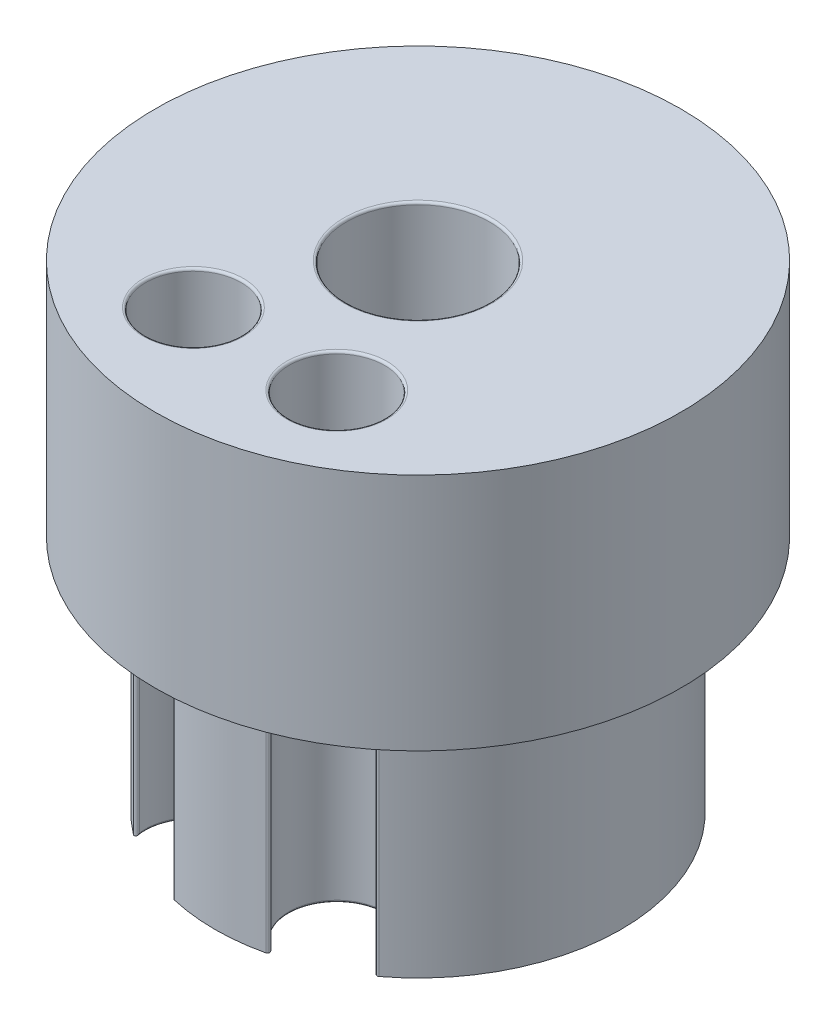
ISO-10303-21;
HEADER;
FILE_DESCRIPTION(('STEP AP214'),'2;1');
FILE_NAME('part.step','',(''),(''),'','','');
FILE_SCHEMA(('AUTOMOTIVE_DESIGN { 1 0 10303 214 1 1 1 1 }'));
ENDSEC;
DATA;
#1=APPLICATION_CONTEXT('core data for automotive mechanical design processes');
#2=APPLICATION_PROTOCOL_DEFINITION('international standard','automotive_design',2000,#1);
#3=PRODUCT_CONTEXT('',#1,'mechanical');
#4=PRODUCT('Part','Part','',(#3));
#5=PRODUCT_RELATED_PRODUCT_CATEGORY('part','',(#4));
#6=PRODUCT_DEFINITION_FORMATION('','',#4);
#7=PRODUCT_DEFINITION_CONTEXT('part definition',#1,'design');
#8=PRODUCT_DEFINITION('design','',#6,#7);
#9=PRODUCT_DEFINITION_SHAPE('','',#8);
#10=(LENGTH_UNIT() NAMED_UNIT(*) SI_UNIT(.MILLI.,.METRE.));
#11=(NAMED_UNIT(*) PLANE_ANGLE_UNIT() SI_UNIT($,.RADIAN.));
#12=(NAMED_UNIT(*) SI_UNIT($,.STERADIAN.) SOLID_ANGLE_UNIT());
#13=UNCERTAINTY_MEASURE_WITH_UNIT(LENGTH_MEASURE(1.E-05),#10,'distance_accuracy_value','');
#14=(GEOMETRIC_REPRESENTATION_CONTEXT(3) GLOBAL_UNCERTAINTY_ASSIGNED_CONTEXT((#13)) GLOBAL_UNIT_ASSIGNED_CONTEXT((#10,
#11,#12)) REPRESENTATION_CONTEXT('',''));
#15=CARTESIAN_POINT('',(0.,0.,0.));
#16=DIRECTION('',(0.,0.,1.));
#17=DIRECTION('',(1.,0.,0.));
#18=AXIS2_PLACEMENT_3D('',#15,#16,#17);
#19=CARTESIAN_POINT('',(0.,-1.,0.));
#20=DIRECTION('',(0.,1.,0.));
#21=DIRECTION('',(0.,0.,1.));
#22=AXIS2_PLACEMENT_3D('',#19,#20,#21);
#23=CYLINDRICAL_SURFACE('',#22,0.425);
#24=CARTESIAN_POINT('',(0.,-0.5,0.));
#25=DIRECTION('',(0.,-1.,0.));
#26=DIRECTION('',(0.,0.,-1.));
#27=AXIS2_PLACEMENT_3D('',#24,#25,#26);
#28=CIRCLE('',#27,0.425);
#29=CARTESIAN_POINT('',(-0.257018482132162,-0.5,0.338476734566025));
#30=VERTEX_POINT('',#29);
#31=CARTESIAN_POINT('',(0.257018482132162,-0.5,0.338476734566025));
#32=VERTEX_POINT('',#31);
#33=EDGE_CURVE('E314',#30,#32,#28,.T.);
#34=ORIENTED_EDGE('',*,*,#33,.T.);
#35=DIRECTION('',(0.,1.,0.));
#36=VECTOR('',#35,1.);
#37=CARTESIAN_POINT('',(0.257018482132162,-1.,0.338476734566025));
#38=LINE('',#37,#36);
#39=CARTESIAN_POINT('',(0.257018482132162,-1.,0.338476734566025));
#40=VERTEX_POINT('',#39);
#41=EDGE_CURVE('E287',#32,#40,#38,.F.);
#42=ORIENTED_EDGE('',*,*,#41,.T.);
#43=CARTESIAN_POINT('',(0.,-1.,0.));
#44=DIRECTION('',(0.,-1.,0.));
#45=DIRECTION('',(0.,0.,-1.));
#46=AXIS2_PLACEMENT_3D('',#43,#44,#45);
#47=CIRCLE('',#46,0.425);
#48=CARTESIAN_POINT('',(-0.257018482132162,-1.,0.338476734566025));
#49=VERTEX_POINT('',#48);
#50=EDGE_CURVE('E147',#49,#40,#47,.T.);
#51=ORIENTED_EDGE('',*,*,#50,.F.);
#52=DIRECTION('',(0.,1.,0.));
#53=VECTOR('',#52,1.);
#54=CARTESIAN_POINT('',(-0.257018482132162,-1.,0.338476734566025));
#55=LINE('',#54,#53);
#56=EDGE_CURVE('E285',#49,#30,#55,.T.);
#57=ORIENTED_EDGE('',*,*,#56,.T.);
#58=EDGE_LOOP('',(#34,#42,#51,#57));
#59=FACE_BOUND('',#58,.T.);
#60=ADVANCED_FACE('F32',(#59),#23,.T.);
#61=CARTESIAN_POINT('',(0.,-0.5,0.));
#62=DIRECTION('',(0.,1.,0.));
#63=DIRECTION('',(0.,0.,1.));
#64=AXIS2_PLACEMENT_3D('',#61,#62,#63);
#65=CYLINDRICAL_SURFACE('',#64,0.55);
#66=CARTESIAN_POINT('',(0.,-0.5,0.));
#67=DIRECTION('',(0.,1.,0.));
#68=DIRECTION('',(0.,0.,1.));
#69=AXIS2_PLACEMENT_3D('',#66,#67,#68);
#70=CIRCLE('',#69,0.55);
#71=CARTESIAN_POINT('',(0.,-0.5,0.55));
#72=VERTEX_POINT('',#71);
#73=EDGE_CURVE('E320',#72,#72,#70,.T.);
#74=ORIENTED_EDGE('',*,*,#73,.T.);
#75=EDGE_LOOP('',(#74));
#76=FACE_BOUND('',#75,.T.);
#77=CARTESIAN_POINT('',(0.,0.,0.));
#78=DIRECTION('',(0.,1.,0.));
#79=DIRECTION('',(0.,0.,1.));
#80=AXIS2_PLACEMENT_3D('',#77,#78,#79);
#81=CIRCLE('',#80,0.55);
#82=CARTESIAN_POINT('',(0.,0.,0.55));
#83=VERTEX_POINT('',#82);
#84=EDGE_CURVE('E146',#83,#83,#81,.T.);
#85=ORIENTED_EDGE('',*,*,#84,.F.);
#86=EDGE_LOOP('',(#85));
#87=FACE_BOUND('',#86,.T.);
#88=ADVANCED_FACE('F344',(#76,#87),#65,.T.);
#89=CARTESIAN_POINT('',(0.,-0.5,0.));
#90=DIRECTION('',(0.,1.,0.));
#91=DIRECTION('',(0.,0.,1.));
#92=AXIS2_PLACEMENT_3D('',#89,#90,#91);
#93=PLANE('',#92);
#94=CARTESIAN_POINT('',(0.0946141518261391,-0.5,0.409204303831497));
#95=DIRECTION('',(0.,1.,0.));
#96=DIRECTION('',(0.,0.,1.));
#97=AXIS2_PLACEMENT_3D('',#94,#95,#96);
#98=CIRCLE('',#97,0.005);
#99=CARTESIAN_POINT('',(0.0957405107764503,-0.5,0.414075783639015));
#100=VERTEX_POINT('',#99);
#101=CARTESIAN_POINT('',(0.098923567361903,-0.5,0.411739838832265));
#102=VERTEX_POINT('',#101);
#103=EDGE_CURVE('E153',#100,#102,#98,.T.);
#104=ORIENTED_EDGE('',*,*,#103,.T.);
#105=CARTESIAN_POINT('',(0.15,-0.5,0.32));
#106=DIRECTION('',(0.,1.,0.));
#107=DIRECTION('',(0.,0.,1.));
#108=AXIS2_PLACEMENT_3D('',#105,#106,#107);
#109=CIRCLE('',#108,0.105);
#110=CARTESIAN_POINT('',(0.253186801406577,-0.5,0.339428947873824));
#111=VERTEX_POINT('',#110);
#112=EDGE_CURVE('E155',#102,#111,#109,.T.);
#113=ORIENTED_EDGE('',*,*,#112,.T.);
#114=CARTESIAN_POINT('',(0.253994735283549,-0.5,0.334494655335836));
#115=DIRECTION('',(0.,1.,0.));
#116=DIRECTION('',(0.,0.,1.));
#117=AXIS2_PLACEMENT_3D('',#114,#115,#116);
#118=CIRCLE('',#117,0.005);
#119=EDGE_CURVE('E174',#111,#32,#118,.T.);
#120=ORIENTED_EDGE('',*,*,#119,.T.);
#121=ORIENTED_EDGE('',*,*,#33,.F.);
#122=CARTESIAN_POINT('',(-0.253994735283549,-0.5,0.334494655335837));
#123=DIRECTION('',(0.,1.,0.));
#124=DIRECTION('',(0.,0.,1.));
#125=AXIS2_PLACEMENT_3D('',#122,#123,#124);
#126=CIRCLE('',#125,0.005);
#127=CARTESIAN_POINT('',(-0.253186801406577,-0.5,0.339428947873824));
#128=VERTEX_POINT('',#127);
#129=EDGE_CURVE('E11',#30,#128,#126,.T.);
#130=ORIENTED_EDGE('',*,*,#129,.T.);
#131=CARTESIAN_POINT('',(-0.15,-0.5,0.32));
#132=DIRECTION('',(0.,1.,0.));
#133=DIRECTION('',(0.,0.,1.));
#134=AXIS2_PLACEMENT_3D('',#131,#132,#133);
#135=CIRCLE('',#134,0.105);
#136=CARTESIAN_POINT('',(-0.0989235673619029,-0.5,0.411739838832265));
#137=VERTEX_POINT('',#136);
#138=EDGE_CURVE('E54',#128,#137,#135,.T.);
#139=ORIENTED_EDGE('',*,*,#138,.T.);
#140=CARTESIAN_POINT('',(-0.0946141518261391,-0.5,0.409204303831497));
#141=DIRECTION('',(0.,1.,0.));
#142=DIRECTION('',(0.,0.,1.));
#143=AXIS2_PLACEMENT_3D('',#140,#141,#142);
#144=CIRCLE('',#143,0.005);
#145=CARTESIAN_POINT('',(-0.0957405107764502,-0.5,0.414075783639015));
#146=VERTEX_POINT('',#145);
#147=EDGE_CURVE('E46',#137,#146,#144,.T.);
#148=ORIENTED_EDGE('',*,*,#147,.T.);
#149=EDGE_CURVE('E312',#100,#146,#28,.T.);
#150=ORIENTED_EDGE('',*,*,#149,.F.);
#151=EDGE_LOOP('',(#104,#113,#120,#121,#130,#139,#148,#150));
#152=FACE_BOUND('',#151,.T.);
#153=ORIENTED_EDGE('',*,*,#73,.F.);
#154=EDGE_LOOP('',(#153));
#155=FACE_BOUND('',#154,.T.);
#156=ADVANCED_FACE('F310',(#152,#155),#93,.F.);
#157=CARTESIAN_POINT('',(0.,0.,0.));
#158=DIRECTION('',(0.,1.,0.));
#159=DIRECTION('',(0.,0.,1.));
#160=AXIS2_PLACEMENT_3D('',#157,#158,#159);
#161=PLANE('',#160);
#162=CARTESIAN_POINT('',(0.,0.,0.));
#163=DIRECTION('',(0.,1.,0.));
#164=DIRECTION('',(0.,0.,1.));
#165=AXIS2_PLACEMENT_3D('',#162,#163,#164);
#166=CIRCLE('',#165,0.155);
#167=CARTESIAN_POINT('',(0.,0.,0.155));
#168=VERTEX_POINT('',#167);
#169=EDGE_CURVE('E334',#168,#168,#166,.F.);
#170=ORIENTED_EDGE('',*,*,#169,.T.);
#171=EDGE_LOOP('',(#170));
#172=FACE_BOUND('',#171,.T.);
#173=CARTESIAN_POINT('',(0.15,0.,0.32));
#174=DIRECTION('',(0.,1.,0.));
#175=DIRECTION('',(0.,0.,1.));
#176=AXIS2_PLACEMENT_3D('',#173,#174,#175);
#177=CIRCLE('',#176,0.105);
#178=CARTESIAN_POINT('',(0.15,0.,0.425));
#179=VERTEX_POINT('',#178);
#180=EDGE_CURVE('E331',#179,#179,#177,.F.);
#181=ORIENTED_EDGE('',*,*,#180,.T.);
#182=EDGE_LOOP('',(#181));
#183=FACE_BOUND('',#182,.T.);
#184=CARTESIAN_POINT('',(-0.15,0.,0.32));
#185=DIRECTION('',(0.,1.,0.));
#186=DIRECTION('',(0.,0.,1.));
#187=AXIS2_PLACEMENT_3D('',#184,#185,#186);
#188=CIRCLE('',#187,0.105);
#189=CARTESIAN_POINT('',(-0.15,0.,0.425));
#190=VERTEX_POINT('',#189);
#191=EDGE_CURVE('E328',#190,#190,#188,.F.);
#192=ORIENTED_EDGE('',*,*,#191,.T.);
#193=EDGE_LOOP('',(#192));
#194=FACE_BOUND('',#193,.T.);
#195=ORIENTED_EDGE('',*,*,#84,.T.);
#196=EDGE_LOOP('',(#195));
#197=FACE_BOUND('',#196,.T.);
#198=ADVANCED_FACE('F354',(#172,#183,#194,#197),#161,.T.);
#199=CARTESIAN_POINT('',(0.0957405107764503,-1.,0.414075783639015));
#200=VERTEX_POINT('',#199);
#201=CARTESIAN_POINT('',(-0.0957405107764502,-1.,0.414075783639015));
#202=VERTEX_POINT('',#201);
#203=EDGE_CURVE('E129',#200,#202,#47,.T.);
#204=ORIENTED_EDGE('',*,*,#203,.F.);
#205=DIRECTION('',(0.,1.,0.));
#206=VECTOR('',#205,1.);
#207=CARTESIAN_POINT('',(0.0957405107764503,-1.,0.414075783639015));
#208=LINE('',#207,#206);
#209=EDGE_CURVE('E142',#200,#100,#208,.T.);
#210=ORIENTED_EDGE('',*,*,#209,.T.);
#211=ORIENTED_EDGE('',*,*,#149,.T.);
#212=DIRECTION('',(0.,1.,0.));
#213=VECTOR('',#212,1.);
#214=CARTESIAN_POINT('',(-0.0957405107764503,-1.,0.414075783639015));
#215=LINE('',#214,#213);
#216=EDGE_CURVE('E145',#146,#202,#215,.F.);
#217=ORIENTED_EDGE('',*,*,#216,.T.);
#218=EDGE_LOOP('',(#204,#210,#211,#217));
#219=FACE_BOUND('',#218,.T.);
#220=ADVANCED_FACE('F140',(#219),#23,.T.);
#221=CARTESIAN_POINT('',(0.,-1.,0.));
#222=DIRECTION('',(0.,-1.,0.));
#223=DIRECTION('',(0.,0.,-1.));
#224=AXIS2_PLACEMENT_3D('',#221,#222,#223);
#225=PLANE('',#224);
#226=CARTESIAN_POINT('',(0.,-1.,0.));
#227=DIRECTION('',(0.,-1.,0.));
#228=DIRECTION('',(0.,0.,-1.));
#229=AXIS2_PLACEMENT_3D('',#226,#227,#228);
#230=CIRCLE('',#229,0.155);
#231=CARTESIAN_POINT('',(0.,-1.,-0.155));
#232=VERTEX_POINT('',#231);
#233=EDGE_CURVE('E282',#232,#232,#230,.F.);
#234=ORIENTED_EDGE('',*,*,#233,.T.);
#235=EDGE_LOOP('',(#234));
#236=FACE_BOUND('',#235,.T.);
#237=ORIENTED_EDGE('',*,*,#50,.T.);
#238=CARTESIAN_POINT('',(0.253994735283549,-1.,0.334494655335836));
#239=DIRECTION('',(0.,-1.,0.));
#240=DIRECTION('',(0.,0.,-1.));
#241=AXIS2_PLACEMENT_3D('',#238,#239,#240);
#242=CIRCLE('',#241,0.005);
#243=CARTESIAN_POINT('',(0.253186801406558,-1.,0.339428947873821));
#244=VERTEX_POINT('',#243);
#245=EDGE_CURVE('E280',#40,#244,#242,.T.);
#246=ORIENTED_EDGE('',*,*,#245,.T.);
#247=CARTESIAN_POINT('',(0.15,-1.,0.32));
#248=DIRECTION('',(0.,-1.,0.));
#249=DIRECTION('',(0.,0.,-1.));
#250=AXIS2_PLACEMENT_3D('',#247,#248,#249);
#251=CIRCLE('',#250,0.105);
#252=CARTESIAN_POINT('',(0.0989235673619124,-1.,0.411739838832248));
#253=VERTEX_POINT('',#252);
#254=EDGE_CURVE('E131',#244,#253,#251,.F.);
#255=ORIENTED_EDGE('',*,*,#254,.T.);
#256=CARTESIAN_POINT('',(0.0946141518261391,-1.,0.409204303831497));
#257=DIRECTION('',(0.,-1.,0.));
#258=DIRECTION('',(0.,0.,-1.));
#259=AXIS2_PLACEMENT_3D('',#256,#257,#258);
#260=CIRCLE('',#259,0.005);
#261=EDGE_CURVE('E125',#253,#200,#260,.T.);
#262=ORIENTED_EDGE('',*,*,#261,.T.);
#263=ORIENTED_EDGE('',*,*,#203,.T.);
#264=CARTESIAN_POINT('',(-0.0946141518261391,-1.,0.409204303831497));
#265=DIRECTION('',(0.,-1.,0.));
#266=DIRECTION('',(0.,0.,-1.));
#267=AXIS2_PLACEMENT_3D('',#264,#265,#266);
#268=CIRCLE('',#267,0.005);
#269=CARTESIAN_POINT('',(-0.0989235673619123,-1.,0.411739838832248));
#270=VERTEX_POINT('',#269);
#271=EDGE_CURVE('E136',#202,#270,#268,.T.);
#272=ORIENTED_EDGE('',*,*,#271,.T.);
#273=CARTESIAN_POINT('',(-0.15,-1.,0.32));
#274=DIRECTION('',(0.,-1.,0.));
#275=DIRECTION('',(0.,0.,-1.));
#276=AXIS2_PLACEMENT_3D('',#273,#274,#275);
#277=CIRCLE('',#276,0.105);
#278=CARTESIAN_POINT('',(-0.253186801406558,-1.,0.339428947873821));
#279=VERTEX_POINT('',#278);
#280=EDGE_CURVE('E273',#270,#279,#277,.F.);
#281=ORIENTED_EDGE('',*,*,#280,.T.);
#282=CARTESIAN_POINT('',(-0.253994735283549,-1.,0.334494655335837));
#283=DIRECTION('',(0.,-1.,0.));
#284=DIRECTION('',(0.,0.,-1.));
#285=AXIS2_PLACEMENT_3D('',#282,#283,#284);
#286=CIRCLE('',#285,0.005);
#287=EDGE_CURVE('E275',#279,#49,#286,.T.);
#288=ORIENTED_EDGE('',*,*,#287,.T.);
#289=EDGE_LOOP('',(#237,#246,#255,#262,#263,#272,#281,#288));
#290=FACE_BOUND('',#289,.T.);
#291=ADVANCED_FACE('F128',(#236,#290),#225,.T.);
#292=CARTESIAN_POINT('',(-0.15,-1.,0.32));
#293=DIRECTION('',(0.,1.,0.));
#294=DIRECTION('',(0.,0.,1.));
#295=AXIS2_PLACEMENT_3D('',#292,#293,#294);
#296=CYLINDRICAL_SURFACE('',#295,0.1);
#297=CARTESIAN_POINT('',(-0.15,-0.995,0.32));
#298=DIRECTION('',(0.,-1.,0.));
#299=DIRECTION('',(0.,0.,-1.));
#300=AXIS2_PLACEMENT_3D('',#297,#298,#299);
#301=CIRCLE('',#300,0.1);
#302=CARTESIAN_POINT('',(-0.249042605031951,-0.995,0.333804433653178));
#303=VERTEX_POINT('',#302);
#304=CARTESIAN_POINT('',(-0.0972515731677516,-0.995,0.404956479839521));
#305=VERTEX_POINT('',#304);
#306=EDGE_CURVE('E169',#303,#305,#301,.T.);
#307=ORIENTED_EDGE('',*,*,#306,.T.);
#308=DIRECTION('',(0.,1.,0.));
#309=VECTOR('',#308,1.);
#310=CARTESIAN_POINT('',(-0.0972515731677516,-1.,0.404956479839521));
#311=LINE('',#310,#309);
#312=CARTESIAN_POINT('',(-0.0972515731677516,-0.495,0.404956479839521));
#313=VERTEX_POINT('',#312);
#314=EDGE_CURVE('E171',#305,#313,#311,.T.);
#315=ORIENTED_EDGE('',*,*,#314,.T.);
#316=CARTESIAN_POINT('',(-0.15,-0.495,0.32));
#317=DIRECTION('',(0.,1.,0.));
#318=DIRECTION('',(0.,0.,1.));
#319=AXIS2_PLACEMENT_3D('',#316,#317,#318);
#320=CIRCLE('',#319,0.1);
#321=CARTESIAN_POINT('',(-0.249042605031951,-0.495,0.333804433653178));
#322=VERTEX_POINT('',#321);
#323=EDGE_CURVE('E165',#313,#322,#320,.F.);
#324=ORIENTED_EDGE('',*,*,#323,.T.);
#325=DIRECTION('',(0.,1.,0.));
#326=VECTOR('',#325,1.);
#327=CARTESIAN_POINT('',(-0.249042605031951,-1.,0.333804433653178));
#328=LINE('',#327,#326);
#329=EDGE_CURVE('E167',#322,#303,#328,.F.);
#330=ORIENTED_EDGE('',*,*,#329,.T.);
#331=EDGE_LOOP('',(#307,#315,#324,#330));
#332=FACE_BOUND('',#331,.T.);
#333=CARTESIAN_POINT('',(-0.15,-0.00500000000000001,0.32));
#334=DIRECTION('',(0.,1.,0.));
#335=DIRECTION('',(0.,0.,1.));
#336=AXIS2_PLACEMENT_3D('',#333,#334,#335);
#337=CIRCLE('',#336,0.1);
#338=CARTESIAN_POINT('',(-0.15,-0.00500000000000001,0.42));
#339=VERTEX_POINT('',#338);
#340=EDGE_CURVE('E162',#339,#339,#337,.T.);
#341=ORIENTED_EDGE('',*,*,#340,.T.);
#342=EDGE_LOOP('',(#341));
#343=FACE_BOUND('',#342,.T.);
#344=ADVANCED_FACE('F271',(#332,#343),#296,.F.);
#345=CARTESIAN_POINT('',(0.15,-1.,0.32));
#346=DIRECTION('',(0.,1.,0.));
#347=DIRECTION('',(0.,0.,1.));
#348=AXIS2_PLACEMENT_3D('',#345,#346,#347);
#349=CYLINDRICAL_SURFACE('',#348,0.1);
#350=CARTESIAN_POINT('',(0.15,-0.995,0.32));
#351=DIRECTION('',(0.,-1.,0.));
#352=DIRECTION('',(0.,0.,-1.));
#353=AXIS2_PLACEMENT_3D('',#350,#351,#352);
#354=CIRCLE('',#353,0.1);
#355=CARTESIAN_POINT('',(0.0972515731677516,-0.995,0.404956479839521));
#356=VERTEX_POINT('',#355);
#357=CARTESIAN_POINT('',(0.249042605031951,-0.995,0.333804433653178));
#358=VERTEX_POINT('',#357);
#359=EDGE_CURVE('E297',#356,#358,#354,.T.);
#360=ORIENTED_EDGE('',*,*,#359,.T.);
#361=DIRECTION('',(0.,1.,0.));
#362=VECTOR('',#361,1.);
#363=CARTESIAN_POINT('',(0.249042605031951,-1.,0.333804433653178));
#364=LINE('',#363,#362);
#365=CARTESIAN_POINT('',(0.249042605031951,-0.495,0.333804433653178));
#366=VERTEX_POINT('',#365);
#367=EDGE_CURVE('E157',#358,#366,#364,.T.);
#368=ORIENTED_EDGE('',*,*,#367,.T.);
#369=CARTESIAN_POINT('',(0.15,-0.495,0.32));
#370=DIRECTION('',(0.,1.,0.));
#371=DIRECTION('',(0.,0.,1.));
#372=AXIS2_PLACEMENT_3D('',#369,#370,#371);
#373=CIRCLE('',#372,0.1);
#374=CARTESIAN_POINT('',(0.0972515731677516,-0.495,0.404956479839521));
#375=VERTEX_POINT('',#374);
#376=EDGE_CURVE('E293',#366,#375,#373,.F.);
#377=ORIENTED_EDGE('',*,*,#376,.T.);
#378=DIRECTION('',(0.,1.,0.));
#379=VECTOR('',#378,1.);
#380=CARTESIAN_POINT('',(0.0972515731677516,-1.,0.404956479839521));
#381=LINE('',#380,#379);
#382=EDGE_CURVE('E295',#375,#356,#381,.F.);
#383=ORIENTED_EDGE('',*,*,#382,.T.);
#384=EDGE_LOOP('',(#360,#368,#377,#383));
#385=FACE_BOUND('',#384,.T.);
#386=CARTESIAN_POINT('',(0.15,-0.00500000000000001,0.32));
#387=DIRECTION('',(0.,1.,0.));
#388=DIRECTION('',(0.,0.,1.));
#389=AXIS2_PLACEMENT_3D('',#386,#387,#388);
#390=CIRCLE('',#389,0.1);
#391=CARTESIAN_POINT('',(0.15,-0.00500000000000001,0.42));
#392=VERTEX_POINT('',#391);
#393=EDGE_CURVE('E290',#392,#392,#390,.T.);
#394=ORIENTED_EDGE('',*,*,#393,.T.);
#395=EDGE_LOOP('',(#394));
#396=FACE_BOUND('',#395,.T.);
#397=ADVANCED_FACE('F301',(#385,#396),#349,.F.);
#398=CARTESIAN_POINT('',(0.,-1.,0.));
#399=DIRECTION('',(0.,1.,0.));
#400=DIRECTION('',(0.,0.,1.));
#401=AXIS2_PLACEMENT_3D('',#398,#399,#400);
#402=CYLINDRICAL_SURFACE('',#401,0.15);
#403=CARTESIAN_POINT('',(0.,-0.00500000000000001,0.));
#404=DIRECTION('',(0.,1.,0.));
#405=DIRECTION('',(0.,0.,1.));
#406=AXIS2_PLACEMENT_3D('',#403,#404,#405);
#407=CIRCLE('',#406,0.15);
#408=CARTESIAN_POINT('',(0.,-0.00500000000000001,0.15));
#409=VERTEX_POINT('',#408);
#410=EDGE_CURVE('E317',#409,#409,#407,.T.);
#411=ORIENTED_EDGE('',*,*,#410,.T.);
#412=EDGE_LOOP('',(#411));
#413=FACE_BOUND('',#412,.T.);
#414=CARTESIAN_POINT('',(0.,-0.995,0.));
#415=DIRECTION('',(0.,-1.,0.));
#416=DIRECTION('',(0.,0.,-1.));
#417=AXIS2_PLACEMENT_3D('',#414,#415,#416);
#418=CIRCLE('',#417,0.15);
#419=CARTESIAN_POINT('',(0.,-0.995,-0.15));
#420=VERTEX_POINT('',#419);
#421=EDGE_CURVE('E313',#420,#420,#418,.T.);
#422=ORIENTED_EDGE('',*,*,#421,.T.);
#423=EDGE_LOOP('',(#422));
#424=FACE_BOUND('',#423,.T.);
#425=ADVANCED_FACE('F370',(#413,#424),#402,.F.);
#426=CARTESIAN_POINT('',(0.,-0.00500000000000001,0.));
#427=DIRECTION('',(0.,1.,0.));
#428=DIRECTION('',(0.,0.,1.));
#429=AXIS2_PLACEMENT_3D('',#426,#427,#428);
#430=TOROIDAL_SURFACE('',#429,0.155,0.005);
#431=ORIENTED_EDGE('',*,*,#169,.F.);
#432=EDGE_LOOP('',(#431));
#433=FACE_BOUND('',#432,.T.);
#434=ORIENTED_EDGE('',*,*,#410,.F.);
#435=EDGE_LOOP('',(#434));
#436=FACE_BOUND('',#435,.T.);
#437=ADVANCED_FACE('F367',(#433,#436),#430,.T.);
#438=CARTESIAN_POINT('',(0.,-0.995,0.));
#439=DIRECTION('',(0.,-1.,0.));
#440=DIRECTION('',(0.,0.,-1.));
#441=AXIS2_PLACEMENT_3D('',#438,#439,#440);
#442=TOROIDAL_SURFACE('',#441,0.155,0.005);
#443=ORIENTED_EDGE('',*,*,#421,.F.);
#444=EDGE_LOOP('',(#443));
#445=FACE_BOUND('',#444,.T.);
#446=ORIENTED_EDGE('',*,*,#233,.F.);
#447=EDGE_LOOP('',(#446));
#448=FACE_BOUND('',#447,.T.);
#449=ADVANCED_FACE('F369',(#445,#448),#442,.T.);
#450=CARTESIAN_POINT('',(0.0946141518261391,-1.,0.409204303831497));
#451=DIRECTION('',(0.,-1.,0.));
#452=DIRECTION('',(0.,0.,-1.));
#453=AXIS2_PLACEMENT_3D('',#450,#451,#452);
#454=CYLINDRICAL_SURFACE('',#453,0.005);
#455=CARTESIAN_POINT('',(0.098923567361903,-1.,0.411739838832265));
#456=CARTESIAN_POINT('',(0.0990371097243361,-1.00000039220774,0.41154761418431));
#457=CARTESIAN_POINT('',(0.0991368599285214,-0.999985084665027,0.411347891269276));
#458=CARTESIAN_POINT('',(0.0993073404714315,-0.999926125869547,0.410942374430836));
#459=CARTESIAN_POINT('',(0.0993783130137966,-0.999882719515652,0.410736647493203));
#460=CARTESIAN_POINT('',(0.0994916343712273,-0.999770669306673,0.410325015866583));
#461=CARTESIAN_POINT('',(0.0995340549529624,-0.999702089402815,0.410119112935657));
#462=CARTESIAN_POINT('',(0.0995926308857317,-0.999543810960538,0.409711475896804));
#463=CARTESIAN_POINT('',(0.0996087287442989,-0.999454066683705,0.409509751861701));
#464=CARTESIAN_POINT('',(0.0996189923593554,-0.999217525606701,0.409033654994556));
#465=CARTESIAN_POINT('',(0.0996015434437093,-0.999062384425994,0.408763186286473));
#466=CARTESIAN_POINT('',(0.0995279521952226,-0.998728172883134,0.408243138129451));
#467=CARTESIAN_POINT('',(0.0994717281722598,-0.998549052645966,0.407993604032138));
#468=CARTESIAN_POINT('',(0.0992981812602483,-0.998097695535768,0.407420327794458));
#469=CARTESIAN_POINT('',(0.0991652956140824,-0.997817262238015,0.407107793735733));
#470=CARTESIAN_POINT('',(0.0988511052001073,-0.997237087976619,0.406529090077766));
#471=CARTESIAN_POINT('',(0.0986697675598421,-0.996937334009943,0.406262952159506));
#472=CARTESIAN_POINT('',(0.0983272725329193,-0.996417232709086,0.405848398224909));
#473=CARTESIAN_POINT('',(0.0981758921381277,-0.996199489579907,0.405688391991599));
#474=CARTESIAN_POINT('',(0.097856142817677,-0.995761317549947,0.405391556833281));
#475=CARTESIAN_POINT('',(0.0976878009922905,-0.995540893413182,0.405254691842708));
#476=CARTESIAN_POINT('',(0.0974268034582191,-0.995213424714667,0.405069112014761));
#477=CARTESIAN_POINT('',(0.0973400306121169,-0.995106699264835,0.405011415097238));
#478=CARTESIAN_POINT('',(0.0972515731677516,-0.995,0.404956479839521));
#479=B_SPLINE_CURVE_WITH_KNOTS('',3,(#455,#456,#457,#458,#459,#460,#461,#462,#463,#464,#465,
#466,#467,#468,#469,#470,#471,#472,#473,#474,#475,#476,#477,#478),.UNSPECIFIED.,.F.,.F.,(4,2,2,
2,2,2,2,2,2,2,2,4),(0.,0.000667863385239623,0.00132998289287642,0.00199043185464566,
0.00265232141076457,0.00358401008673467,0.00451766763406962,0.00583187130905372,
0.00714696888499546,0.00807488231615755,0.00900133599344947,0.0094486562116236),.UNSPECIFIED.);
#480=EDGE_CURVE('E219',#356,#253,#479,.F.);
#481=ORIENTED_EDGE('',*,*,#480,.F.);
#482=ORIENTED_EDGE('',*,*,#382,.F.);
#483=CARTESIAN_POINT('',(0.098923567361903,-0.5,0.411739838832265));
#484=CARTESIAN_POINT('',(0.099037109724336,-0.500000392207745,0.41154761418431));
#485=CARTESIAN_POINT('',(0.0991368599285213,-0.499985084665027,0.411347891269276));
#486=CARTESIAN_POINT('',(0.0993073404714314,-0.499926125869547,0.410942374430836));
#487=CARTESIAN_POINT('',(0.0993783130137966,-0.499882719515652,0.410736647493203));
#488=CARTESIAN_POINT('',(0.0994916343712273,-0.499770669306673,0.410325015866583));
#489=CARTESIAN_POINT('',(0.0995340549529624,-0.499702089402815,0.410119112935657));
#490=CARTESIAN_POINT('',(0.0995926308857317,-0.499543810960538,0.409711475896804));
#491=CARTESIAN_POINT('',(0.0996087287442989,-0.499454066683705,0.409509751861701));
#492=CARTESIAN_POINT('',(0.0996189923593554,-0.499217525606701,0.409033654994556));
#493=CARTESIAN_POINT('',(0.0996015434437093,-0.499062384425994,0.408763186286473));
#494=CARTESIAN_POINT('',(0.0995279521952226,-0.498728172883134,0.408243138129451));
#495=CARTESIAN_POINT('',(0.0994717281722598,-0.498549052645966,0.407993604032138));
#496=CARTESIAN_POINT('',(0.0992981812602483,-0.498097695535768,0.407420327794458));
#497=CARTESIAN_POINT('',(0.0991652956140825,-0.497817262238015,0.407107793735733));
#498=CARTESIAN_POINT('',(0.0988511052001073,-0.497237087976618,0.406529090077766));
#499=CARTESIAN_POINT('',(0.0986697675598422,-0.496937334009943,0.406262952159506));
#500=CARTESIAN_POINT('',(0.0983272725329193,-0.496417232709087,0.405848398224909));
#501=CARTESIAN_POINT('',(0.0981758921381277,-0.496199489579907,0.405688391991599));
#502=CARTESIAN_POINT('',(0.0978561428176769,-0.495761317549946,0.405391556833281));
#503=CARTESIAN_POINT('',(0.0976878009922906,-0.495540893413182,0.405254691842708));
#504=CARTESIAN_POINT('',(0.0974268034582191,-0.495213424714667,0.405069112014762));
#505=CARTESIAN_POINT('',(0.0973400306121169,-0.495106699264835,0.405011415097238));
#506=CARTESIAN_POINT('',(0.0972515731677516,-0.495,0.404956479839521));
#507=B_SPLINE_CURVE_WITH_KNOTS('',3,(#483,#484,#485,#486,#487,#488,#489,#490,#491,#492,#493,
#494,#495,#496,#497,#498,#499,#500,#501,#502,#503,#504,#505,#506),.UNSPECIFIED.,.F.,.F.,(4,2,2,
2,2,2,2,2,2,2,2,4),(0.,0.000667863385239556,0.00132998289287641,0.00199043185464555,
0.00265232141076456,0.00358401008673453,0.00451766763406952,0.00583187130905368,
0.00714696888499545,0.00807488231615759,0.00900133599344971,0.00944865621162361),.UNSPECIFIED.);
#508=EDGE_CURVE('E212',#102,#375,#507,.T.);
#509=ORIENTED_EDGE('',*,*,#508,.F.);
#510=ORIENTED_EDGE('',*,*,#103,.F.);
#511=ORIENTED_EDGE('',*,*,#209,.F.);
#512=ORIENTED_EDGE('',*,*,#261,.F.);
#513=EDGE_LOOP('',(#481,#482,#509,#510,#511,#512));
#514=FACE_BOUND('',#513,.T.);
#515=ADVANCED_FACE('F150',(#514),#454,.T.);
#516=CARTESIAN_POINT('',(0.15,-0.495,0.32));
#517=DIRECTION('',(0.,1.,0.));
#518=DIRECTION('',(0.,0.,1.));
#519=AXIS2_PLACEMENT_3D('',#516,#517,#518);
#520=TOROIDAL_SURFACE('',#519,0.105,0.005);
#521=ORIENTED_EDGE('',*,*,#508,.T.);
#522=ORIENTED_EDGE('',*,*,#376,.F.);
#523=CARTESIAN_POINT('',(0.253186801406577,-0.5,0.339428947873824));
#524=CARTESIAN_POINT('',(0.252966420293989,-0.500000392207745,0.339393249854785));
#525=CARTESIAN_POINT('',(0.252749098907619,-0.499985084665027,0.339342154247824));
#526=CARTESIAN_POINT('',(0.252328354216917,-0.499926125869547,0.33921377423764));
#527=CARTESIAN_POINT('',(0.252124827458328,-0.499882719515652,0.339136718847329));
#528=CARTESIAN_POINT('',(0.25173594825405,-0.499770669306673,0.338960493734009));
#529=CARTESIAN_POINT('',(0.251550551249651,-0.499702089402815,0.338861380296584));
#530=CARTESIAN_POINT('',(0.251199763637496,-0.499543810960538,0.338645632419415));
#531=CARTESIAN_POINT('',(0.251034417550471,-0.499454066683705,0.338528960233808));
#532=CARTESIAN_POINT('',(0.250661916653041,-0.499217525606701,0.338232284231891));
#533=CARTESIAN_POINT('',(0.250465192652915,-0.499062384425994,0.338045850719658));
#534=CARTESIAN_POINT('',(0.250112553082698,-0.498728172883134,0.337656606463447));
#535=CARTESIAN_POINT('',(0.249956724628677,-0.498549052645966,0.337453761943193));
#536=CARTESIAN_POINT('',(0.249627115977375,-0.498097695535768,0.336953639645805));
#537=CARTESIAN_POINT('',(0.249471906157447,-0.497817262238015,0.33665157004353));
#538=CARTESIAN_POINT('',(0.249228097213587,-0.497237087976618,0.336039875071448));
#539=CARTESIAN_POINT('',(0.249139543469025,-0.496937334009943,0.335730244702076));
#540=CARTESIAN_POINT('',(0.249040009241081,-0.496417232709087,0.335201802892958));
#541=CARTESIAN_POINT('',(0.249013865887567,-0.496199489579907,0.334983091796549));
#542=CARTESIAN_POINT('',(0.248990261367995,-0.495761317549946,0.33454743876282));
#543=CARTESIAN_POINT('',(0.248992755145044,-0.495540893413182,0.334330494583605));
#544=CARTESIAN_POINT('',(0.249017078919979,-0.495213424714667,0.334011170392061));
#545=CARTESIAN_POINT('',(0.249028241820871,-0.495106699264835,0.333907566093135));
#546=CARTESIAN_POINT('',(0.249042605031951,-0.495,0.333804433653178));
#547=B_SPLINE_CURVE_WITH_KNOTS('',3,(#523,#524,#525,#526,#527,#528,#529,#530,#531,#532,#533,
#534,#535,#536,#537,#538,#539,#540,#541,#542,#543,#544,#545,#546),.UNSPECIFIED.,.F.,.F.,(4,2,2,
2,2,2,2,2,2,2,2,4),(0.,0.000667863385239624,0.00132998289287643,0.00199043185464558,
0.00265232141076452,0.00358401008673452,0.00451766763406955,0.00583187130905373,
0.0071469688849955,0.00807488231615762,0.00900133599344971,0.0094486562116236),.UNSPECIFIED.);
#548=EDGE_CURVE('E187',#111,#366,#547,.T.);
#549=ORIENTED_EDGE('',*,*,#548,.F.);
#550=ORIENTED_EDGE('',*,*,#112,.F.);
#551=EDGE_LOOP('',(#521,#522,#549,#550));
#552=FACE_BOUND('',#551,.T.);
#553=ADVANCED_FACE('F202',(#552),#520,.T.);
#554=CARTESIAN_POINT('',(0.15,-0.995,0.32));
#555=DIRECTION('',(0.,-1.,0.));
#556=DIRECTION('',(0.,0.,-1.));
#557=AXIS2_PLACEMENT_3D('',#554,#555,#556);
#558=TOROIDAL_SURFACE('',#557,0.105,0.005);
#559=ORIENTED_EDGE('',*,*,#480,.T.);
#560=ORIENTED_EDGE('',*,*,#254,.F.);
#561=CARTESIAN_POINT('',(0.253186801406577,-1.,0.339428947873824));
#562=CARTESIAN_POINT('',(0.252966420293989,-1.00000039220774,0.339393249854785));
#563=CARTESIAN_POINT('',(0.252749098907619,-0.999985084665027,0.339342154247824));
#564=CARTESIAN_POINT('',(0.252328354216917,-0.999926125869547,0.33921377423764));
#565=CARTESIAN_POINT('',(0.252124827458328,-0.999882719515652,0.339136718847329));
#566=CARTESIAN_POINT('',(0.25173594825405,-0.999770669306673,0.338960493734009));
#567=CARTESIAN_POINT('',(0.251550551249651,-0.999702089402815,0.338861380296584));
#568=CARTESIAN_POINT('',(0.251199763637496,-0.999543810960538,0.338645632419414));
#569=CARTESIAN_POINT('',(0.251034417550471,-0.999454066683705,0.338528960233808));
#570=CARTESIAN_POINT('',(0.250661916653041,-0.999217525606701,0.338232284231891));
#571=CARTESIAN_POINT('',(0.250465192652915,-0.999062384425994,0.338045850719658));
#572=CARTESIAN_POINT('',(0.250112553082698,-0.998728172883134,0.337656606463447));
#573=CARTESIAN_POINT('',(0.249956724628677,-0.998549052645966,0.337453761943193));
#574=CARTESIAN_POINT('',(0.249627115977375,-0.998097695535768,0.336953639645805));
#575=CARTESIAN_POINT('',(0.249471906157447,-0.997817262238015,0.33665157004353));
#576=CARTESIAN_POINT('',(0.249228097213587,-0.997237087976619,0.336039875071448));
#577=CARTESIAN_POINT('',(0.249139543469025,-0.996937334009943,0.335730244702076));
#578=CARTESIAN_POINT('',(0.249040009241081,-0.996417232709086,0.335201802892958));
#579=CARTESIAN_POINT('',(0.249013865887567,-0.996199489579907,0.334983091796549));
#580=CARTESIAN_POINT('',(0.248990261367995,-0.995761317549947,0.33454743876282));
#581=CARTESIAN_POINT('',(0.248992755145044,-0.995540893413182,0.334330494583605));
#582=CARTESIAN_POINT('',(0.249017078919979,-0.995213424714667,0.334011170392061));
#583=CARTESIAN_POINT('',(0.249028241820871,-0.995106699264835,0.333907566093135));
#584=CARTESIAN_POINT('',(0.249042605031951,-0.995,0.333804433653178));
#585=B_SPLINE_CURVE_WITH_KNOTS('',3,(#561,#562,#563,#564,#565,#566,#567,#568,#569,#570,#571,
#572,#573,#574,#575,#576,#577,#578,#579,#580,#581,#582,#583,#584),.UNSPECIFIED.,.F.,.F.,(4,2,2,
2,2,2,2,2,2,2,2,4),(0.,0.000667863385239624,0.00132998289287643,0.00199043185464554,
0.00265232141076465,0.00358401008673471,0.00451766763406965,0.00583187130905376,
0.00714696888499549,0.00807488231615753,0.00900133599344947,0.0094486562116236),.UNSPECIFIED.);
#586=EDGE_CURVE('E178',#358,#244,#585,.F.);
#587=ORIENTED_EDGE('',*,*,#586,.F.);
#588=ORIENTED_EDGE('',*,*,#359,.F.);
#589=EDGE_LOOP('',(#559,#560,#587,#588));
#590=FACE_BOUND('',#589,.T.);
#591=ADVANCED_FACE('F194',(#590),#558,.T.);
#592=CARTESIAN_POINT('',(0.253994735283549,-1.,0.334494655335836));
#593=DIRECTION('',(0.,1.,0.));
#594=DIRECTION('',(0.,0.,1.));
#595=AXIS2_PLACEMENT_3D('',#592,#593,#594);
#596=CYLINDRICAL_SURFACE('',#595,0.005);
#597=ORIENTED_EDGE('',*,*,#548,.T.);
#598=ORIENTED_EDGE('',*,*,#367,.F.);
#599=ORIENTED_EDGE('',*,*,#586,.T.);
#600=ORIENTED_EDGE('',*,*,#245,.F.);
#601=ORIENTED_EDGE('',*,*,#41,.F.);
#602=ORIENTED_EDGE('',*,*,#119,.F.);
#603=EDGE_LOOP('',(#597,#598,#599,#600,#601,#602));
#604=FACE_BOUND('',#603,.T.);
#605=ADVANCED_FACE('F197',(#604),#596,.T.);
#606=CARTESIAN_POINT('',(0.15,-0.00500000000000001,0.32));
#607=DIRECTION('',(0.,1.,0.));
#608=DIRECTION('',(0.,0.,1.));
#609=AXIS2_PLACEMENT_3D('',#606,#607,#608);
#610=TOROIDAL_SURFACE('',#609,0.105,0.005);
#611=ORIENTED_EDGE('',*,*,#180,.F.);
#612=EDGE_LOOP('',(#611));
#613=FACE_BOUND('',#612,.T.);
#614=ORIENTED_EDGE('',*,*,#393,.F.);
#615=EDGE_LOOP('',(#614));
#616=FACE_BOUND('',#615,.T.);
#617=ADVANCED_FACE('F200',(#613,#616),#610,.T.);
#618=CARTESIAN_POINT('',(-0.253994735283549,-1.,0.334494655335837));
#619=DIRECTION('',(0.,-1.,0.));
#620=DIRECTION('',(0.,0.,-1.));
#621=AXIS2_PLACEMENT_3D('',#618,#619,#620);
#622=CYLINDRICAL_SURFACE('',#621,0.005);
#623=CARTESIAN_POINT('',(-0.253186801406577,-1.,0.339428947873824));
#624=CARTESIAN_POINT('',(-0.252966420293989,-1.00000039220774,0.339393249854785));
#625=CARTESIAN_POINT('',(-0.252749098907619,-0.999985084665027,0.339342154247824));
#626=CARTESIAN_POINT('',(-0.252328354216917,-0.999926125869547,0.33921377423764));
#627=CARTESIAN_POINT('',(-0.252124827458328,-0.999882719515652,0.339136718847329));
#628=CARTESIAN_POINT('',(-0.25173594825405,-0.999770669306673,0.338960493734009));
#629=CARTESIAN_POINT('',(-0.251550551249651,-0.999702089402815,0.338861380296584));
#630=CARTESIAN_POINT('',(-0.251199763637496,-0.999543810960538,0.338645632419414));
#631=CARTESIAN_POINT('',(-0.251034417550471,-0.999454066683705,0.338528960233808));
#632=CARTESIAN_POINT('',(-0.250661916653041,-0.999217525606701,0.338232284231891));
#633=CARTESIAN_POINT('',(-0.250465192652915,-0.999062384425994,0.338045850719658));
#634=CARTESIAN_POINT('',(-0.250112553082698,-0.998728172883134,0.337656606463447));
#635=CARTESIAN_POINT('',(-0.249956724628676,-0.998549052645966,0.337453761943193));
#636=CARTESIAN_POINT('',(-0.249627115977375,-0.998097695535768,0.336953639645804));
#637=CARTESIAN_POINT('',(-0.249471906157447,-0.997817262238014,0.33665157004353));
#638=CARTESIAN_POINT('',(-0.249228097213587,-0.997237087976618,0.336039875071448));
#639=CARTESIAN_POINT('',(-0.249139543469024,-0.996937334009943,0.335730244702076));
#640=CARTESIAN_POINT('',(-0.249040009241081,-0.996417232709086,0.335201802892958));
#641=CARTESIAN_POINT('',(-0.249013865887567,-0.996199489579907,0.334983091796549));
#642=CARTESIAN_POINT('',(-0.248990261367995,-0.995761317549947,0.334547438762819));
#643=CARTESIAN_POINT('',(-0.248992755145044,-0.995540893413183,0.334330494583604));
#644=CARTESIAN_POINT('',(-0.249017078919979,-0.995213424714668,0.334011170392061));
#645=CARTESIAN_POINT('',(-0.249028241820871,-0.995106699264836,0.333907566093135));
#646=CARTESIAN_POINT('',(-0.249042605031951,-0.995,0.333804433653178));
#647=B_SPLINE_CURVE_WITH_KNOTS('',3,(#623,#624,#625,#626,#627,#628,#629,#630,#631,#632,#633,
#634,#635,#636,#637,#638,#639,#640,#641,#642,#643,#644,#645,#646),.UNSPECIFIED.,.F.,.F.,(4,2,2,
2,2,2,2,2,2,2,2,4),(0.,0.000667863385239636,0.00132998289287644,0.00199043185464556,
0.00265232141076466,0.00358401008673472,0.00451766763406973,0.00583187130905405,
0.00714696888499594,0.00807488231615786,0.00900133599344945,0.00944865621162354),.UNSPECIFIED.);
#648=EDGE_CURVE('E254',#303,#279,#647,.F.);
#649=ORIENTED_EDGE('',*,*,#648,.F.);
#650=ORIENTED_EDGE('',*,*,#329,.F.);
#651=CARTESIAN_POINT('',(-0.253186801406577,-0.5,0.339428947873824));
#652=CARTESIAN_POINT('',(-0.252966420293989,-0.500000392207745,0.339393249854785));
#653=CARTESIAN_POINT('',(-0.252749098907619,-0.499985084665027,0.339342154247824));
#654=CARTESIAN_POINT('',(-0.252328354216917,-0.499926125869547,0.33921377423764));
#655=CARTESIAN_POINT('',(-0.252124827458328,-0.499882719515652,0.339136718847329));
#656=CARTESIAN_POINT('',(-0.25173594825405,-0.499770669306673,0.338960493734009));
#657=CARTESIAN_POINT('',(-0.251550551249651,-0.499702089402815,0.338861380296584));
#658=CARTESIAN_POINT('',(-0.251199763637496,-0.499543810960538,0.338645632419414));
#659=CARTESIAN_POINT('',(-0.251034417550471,-0.499454066683705,0.338528960233808));
#660=CARTESIAN_POINT('',(-0.250661916653041,-0.499217525606701,0.338232284231891));
#661=CARTESIAN_POINT('',(-0.250465192652915,-0.499062384425994,0.338045850719658));
#662=CARTESIAN_POINT('',(-0.250112553082698,-0.498728172883134,0.337656606463447));
#663=CARTESIAN_POINT('',(-0.249956724628676,-0.498549052645966,0.337453761943193));
#664=CARTESIAN_POINT('',(-0.249627115977375,-0.498097695535768,0.336953639645804));
#665=CARTESIAN_POINT('',(-0.249471906157447,-0.497817262238015,0.33665157004353));
#666=CARTESIAN_POINT('',(-0.249228097213587,-0.497237087976618,0.336039875071448));
#667=CARTESIAN_POINT('',(-0.249139543469024,-0.496937334009943,0.335730244702076));
#668=CARTESIAN_POINT('',(-0.249040009241081,-0.496417232709087,0.335201802892958));
#669=CARTESIAN_POINT('',(-0.249013865887567,-0.496199489579907,0.334983091796549));
#670=CARTESIAN_POINT('',(-0.248990261367995,-0.495761317549947,0.334547438762819));
#671=CARTESIAN_POINT('',(-0.248992755145044,-0.495540893413183,0.334330494583604));
#672=CARTESIAN_POINT('',(-0.249017078919979,-0.495213424714667,0.334011170392061));
#673=CARTESIAN_POINT('',(-0.249028241820871,-0.495106699264836,0.333907566093135));
#674=CARTESIAN_POINT('',(-0.249042605031951,-0.495,0.333804433653178));
#675=B_SPLINE_CURVE_WITH_KNOTS('',3,(#651,#652,#653,#654,#655,#656,#657,#658,#659,#660,#661,
#662,#663,#664,#665,#666,#667,#668,#669,#670,#671,#672,#673,#674),.UNSPECIFIED.,.F.,.F.,(4,2,2,
2,2,2,2,2,2,2,2,4),(0.,0.000667863385239636,0.00132998289287644,0.00199043185464559,
0.00265232141076456,0.0035840100867346,0.00451766763406969,0.00583187130905389,
0.00714696888499559,0.00807488231615755,0.0090013359934496,0.00944865621162354),.UNSPECIFIED.);
#676=EDGE_CURVE('E36',#128,#322,#675,.T.);
#677=ORIENTED_EDGE('',*,*,#676,.F.);
#678=ORIENTED_EDGE('',*,*,#129,.F.);
#679=ORIENTED_EDGE('',*,*,#56,.F.);
#680=ORIENTED_EDGE('',*,*,#287,.F.);
#681=EDGE_LOOP('',(#649,#650,#677,#678,#679,#680));
#682=FACE_BOUND('',#681,.T.);
#683=ADVANCED_FACE('F248',(#682),#622,.T.);
#684=CARTESIAN_POINT('',(-0.15,-0.495,0.32));
#685=DIRECTION('',(0.,1.,0.));
#686=DIRECTION('',(0.,0.,1.));
#687=AXIS2_PLACEMENT_3D('',#684,#685,#686);
#688=TOROIDAL_SURFACE('',#687,0.105,0.005);
#689=ORIENTED_EDGE('',*,*,#676,.T.);
#690=ORIENTED_EDGE('',*,*,#323,.F.);
#691=CARTESIAN_POINT('',(-0.0989235673619029,-0.5,0.411739838832265));
#692=CARTESIAN_POINT('',(-0.099037109724336,-0.500000392207745,0.41154761418431));
#693=CARTESIAN_POINT('',(-0.0991368599285213,-0.499985084665027,0.411347891269276));
#694=CARTESIAN_POINT('',(-0.0993073404714314,-0.499926125869547,0.410942374430836));
#695=CARTESIAN_POINT('',(-0.0993783130137965,-0.499882719515652,0.410736647493203));
#696=CARTESIAN_POINT('',(-0.0994916343712272,-0.499770669306673,0.410325015866583));
#697=CARTESIAN_POINT('',(-0.0995340549529624,-0.499702089402815,0.410119112935657));
#698=CARTESIAN_POINT('',(-0.0995926308857316,-0.499543810960538,0.409711475896804));
#699=CARTESIAN_POINT('',(-0.0996087287442988,-0.499454066683705,0.409509751861701));
#700=CARTESIAN_POINT('',(-0.0996189923593553,-0.499217525606701,0.409033654994556));
#701=CARTESIAN_POINT('',(-0.0996015434437092,-0.499062384425994,0.408763186286473));
#702=CARTESIAN_POINT('',(-0.0995279521952225,-0.498728172883134,0.408243138129451));
#703=CARTESIAN_POINT('',(-0.0994717281722597,-0.498549052645966,0.407993604032138));
#704=CARTESIAN_POINT('',(-0.0992981812602482,-0.498097695535768,0.407420327794458));
#705=CARTESIAN_POINT('',(-0.0991652956140823,-0.497817262238015,0.407107793735733));
#706=CARTESIAN_POINT('',(-0.0988511052001071,-0.497237087976618,0.406529090077766));
#707=CARTESIAN_POINT('',(-0.0986697675598419,-0.496937334009943,0.406262952159506));
#708=CARTESIAN_POINT('',(-0.0983272725329191,-0.496417232709087,0.405848398224909));
#709=CARTESIAN_POINT('',(-0.0981758921381276,-0.496199489579907,0.405688391991599));
#710=CARTESIAN_POINT('',(-0.0978561428176767,-0.495761317549947,0.405391556833281));
#711=CARTESIAN_POINT('',(-0.09768780099229,-0.495540893413183,0.405254691842708));
#712=CARTESIAN_POINT('',(-0.0974268034582186,-0.495213424714667,0.405069112014761));
#713=CARTESIAN_POINT('',(-0.0973400306121166,-0.495106699264835,0.405011415097238));
#714=CARTESIAN_POINT('',(-0.0972515731677515,-0.495,0.404956479839521));
#715=B_SPLINE_CURVE_WITH_KNOTS('',3,(#691,#692,#693,#694,#695,#696,#697,#698,#699,#700,#701,
#702,#703,#704,#705,#706,#707,#708,#709,#710,#711,#712,#713,#714),.UNSPECIFIED.,.F.,.F.,(4,2,2,
2,2,2,2,2,2,2,2,4),(0.,0.000667863385239629,0.00132998289287642,0.00199043185464564,
0.00265232141076456,0.00358401008673452,0.00451766763406956,0.00583187130905385,
0.00714696888499556,0.00807488231615759,0.00900133599344968,0.00944865621162359),.UNSPECIFIED.);
#716=EDGE_CURVE('E233',#137,#313,#715,.T.);
#717=ORIENTED_EDGE('',*,*,#716,.F.);
#718=ORIENTED_EDGE('',*,*,#138,.F.);
#719=EDGE_LOOP('',(#689,#690,#717,#718));
#720=FACE_BOUND('',#719,.T.);
#721=ADVANCED_FACE('F244',(#720),#688,.T.);
#722=CARTESIAN_POINT('',(-0.15,-0.995,0.32));
#723=DIRECTION('',(0.,-1.,0.));
#724=DIRECTION('',(0.,0.,-1.));
#725=AXIS2_PLACEMENT_3D('',#722,#723,#724);
#726=TOROIDAL_SURFACE('',#725,0.105,0.005);
#727=ORIENTED_EDGE('',*,*,#648,.T.);
#728=ORIENTED_EDGE('',*,*,#280,.F.);
#729=CARTESIAN_POINT('',(-0.0989235673619029,-1.,0.411739838832265));
#730=CARTESIAN_POINT('',(-0.099037109724336,-1.00000039220774,0.41154761418431));
#731=CARTESIAN_POINT('',(-0.0991368599285213,-0.999985084665027,0.411347891269276));
#732=CARTESIAN_POINT('',(-0.0993073404714314,-0.999926125869547,0.410942374430836));
#733=CARTESIAN_POINT('',(-0.0993783130137965,-0.999882719515652,0.410736647493203));
#734=CARTESIAN_POINT('',(-0.0994916343712272,-0.999770669306673,0.410325015866583));
#735=CARTESIAN_POINT('',(-0.0995340549529624,-0.999702089402815,0.410119112935657));
#736=CARTESIAN_POINT('',(-0.0995926308857316,-0.999543810960538,0.409711475896804));
#737=CARTESIAN_POINT('',(-0.0996087287442988,-0.999454066683705,0.409509751861701));
#738=CARTESIAN_POINT('',(-0.0996189923593553,-0.999217525606701,0.409033654994556));
#739=CARTESIAN_POINT('',(-0.0996015434437092,-0.999062384425994,0.408763186286473));
#740=CARTESIAN_POINT('',(-0.0995279521952225,-0.998728172883134,0.408243138129451));
#741=CARTESIAN_POINT('',(-0.0994717281722597,-0.998549052645966,0.407993604032138));
#742=CARTESIAN_POINT('',(-0.0992981812602482,-0.998097695535768,0.407420327794458));
#743=CARTESIAN_POINT('',(-0.0991652956140823,-0.997817262238015,0.407107793735733));
#744=CARTESIAN_POINT('',(-0.0988511052001072,-0.997237087976619,0.406529090077766));
#745=CARTESIAN_POINT('',(-0.0986697675598419,-0.996937334009943,0.406262952159506));
#746=CARTESIAN_POINT('',(-0.0983272725329191,-0.996417232709086,0.405848398224909));
#747=CARTESIAN_POINT('',(-0.0981758921381276,-0.996199489579907,0.405688391991599));
#748=CARTESIAN_POINT('',(-0.0978561428176766,-0.995761317549947,0.405391556833281));
#749=CARTESIAN_POINT('',(-0.09768780099229,-0.995540893413183,0.405254691842708));
#750=CARTESIAN_POINT('',(-0.0974268034582186,-0.995213424714667,0.405069112014761));
#751=CARTESIAN_POINT('',(-0.0973400306121166,-0.995106699264835,0.405011415097238));
#752=CARTESIAN_POINT('',(-0.0972515731677515,-0.995,0.404956479839521));
#753=B_SPLINE_CURVE_WITH_KNOTS('',3,(#729,#730,#731,#732,#733,#734,#735,#736,#737,#738,#739,
#740,#741,#742,#743,#744,#745,#746,#747,#748,#749,#750,#751,#752),.UNSPECIFIED.,.F.,.F.,(4,2,2,
2,2,2,2,2,2,2,2,4),(0.,0.000667863385239617,0.00132998289287641,0.00199043185464544,
0.00265232141076455,0.00358401008673465,0.00451766763406961,0.00583187130905371,
0.00714696888499554,0.0080748823161577,0.0090013359934496,0.00944865621162357),.UNSPECIFIED.);
#754=EDGE_CURVE('E224',#305,#270,#753,.F.);
#755=ORIENTED_EDGE('',*,*,#754,.F.);
#756=ORIENTED_EDGE('',*,*,#306,.F.);
#757=EDGE_LOOP('',(#727,#728,#755,#756));
#758=FACE_BOUND('',#757,.T.);
#759=ADVANCED_FACE('F238',(#758),#726,.T.);
#760=CARTESIAN_POINT('',(-0.0946141518261391,-1.,0.409204303831497));
#761=DIRECTION('',(0.,1.,0.));
#762=DIRECTION('',(0.,0.,1.));
#763=AXIS2_PLACEMENT_3D('',#760,#761,#762);
#764=CYLINDRICAL_SURFACE('',#763,0.005);
#765=ORIENTED_EDGE('',*,*,#716,.T.);
#766=ORIENTED_EDGE('',*,*,#314,.F.);
#767=ORIENTED_EDGE('',*,*,#754,.T.);
#768=ORIENTED_EDGE('',*,*,#271,.F.);
#769=ORIENTED_EDGE('',*,*,#216,.F.);
#770=ORIENTED_EDGE('',*,*,#147,.F.);
#771=EDGE_LOOP('',(#765,#766,#767,#768,#769,#770));
#772=FACE_BOUND('',#771,.T.);
#773=ADVANCED_FACE('F240',(#772),#764,.T.);
#774=CARTESIAN_POINT('',(-0.15,-0.00500000000000001,0.32));
#775=DIRECTION('',(0.,1.,0.));
#776=DIRECTION('',(0.,0.,1.));
#777=AXIS2_PLACEMENT_3D('',#774,#775,#776);
#778=TOROIDAL_SURFACE('',#777,0.105,0.005);
#779=ORIENTED_EDGE('',*,*,#191,.F.);
#780=EDGE_LOOP('',(#779));
#781=FACE_BOUND('',#780,.T.);
#782=ORIENTED_EDGE('',*,*,#340,.F.);
#783=EDGE_LOOP('',(#782));
#784=FACE_BOUND('',#783,.T.);
#785=ADVANCED_FACE('F34',(#781,#784),#778,.T.);
#786=CLOSED_SHELL('',(#60,#88,#156,#198,#220,#291,#344,#397,#425,#437,#449,#515,#553,#591,#605,
#617,#683,#721,#759,#773,#785));
#787=MANIFOLD_SOLID_BREP('B2',#786);
#788=ADVANCED_BREP_SHAPE_REPRESENTATION('',(#18,#787),#14);
#789=SHAPE_DEFINITION_REPRESENTATION(#9,#788);
ENDSEC;
END-ISO-10303-21;
